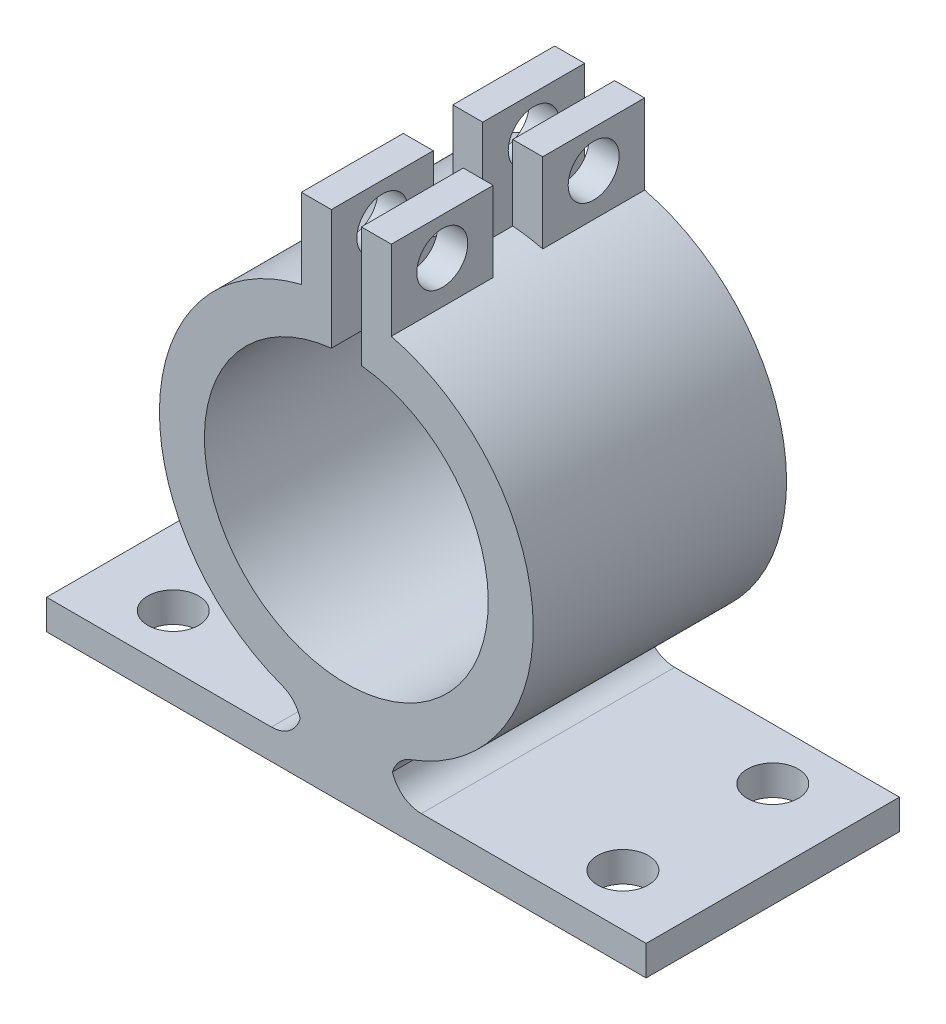
ISO-10303-21;
HEADER;
FILE_DESCRIPTION(('STEP AP214'),'2;1');
FILE_NAME('part.step','',(''),(''),'','','');
FILE_SCHEMA(('AUTOMOTIVE_DESIGN { 1 0 10303 214 1 1 1 1 }'));
ENDSEC;
DATA;
#1=APPLICATION_CONTEXT('core data for automotive mechanical design processes');
#2=APPLICATION_PROTOCOL_DEFINITION('international standard','automotive_design',2000,#1);
#3=PRODUCT_CONTEXT('',#1,'mechanical');
#4=PRODUCT('Part','Part','',(#3));
#5=PRODUCT_RELATED_PRODUCT_CATEGORY('part','',(#4));
#6=PRODUCT_DEFINITION_FORMATION('','',#4);
#7=PRODUCT_DEFINITION_CONTEXT('part definition',#1,'design');
#8=PRODUCT_DEFINITION('design','',#6,#7);
#9=PRODUCT_DEFINITION_SHAPE('','',#8);
#10=(LENGTH_UNIT() NAMED_UNIT(*) SI_UNIT(.MILLI.,.METRE.));
#11=(NAMED_UNIT(*) PLANE_ANGLE_UNIT() SI_UNIT($,.RADIAN.));
#12=(NAMED_UNIT(*) SI_UNIT($,.STERADIAN.) SOLID_ANGLE_UNIT());
#13=UNCERTAINTY_MEASURE_WITH_UNIT(LENGTH_MEASURE(1.E-05),#10,'distance_accuracy_value','');
#14=(GEOMETRIC_REPRESENTATION_CONTEXT(3) GLOBAL_UNCERTAINTY_ASSIGNED_CONTEXT((#13)) GLOBAL_UNIT_ASSIGNED_CONTEXT((#10,
#11,#12)) REPRESENTATION_CONTEXT('',''));
#15=CARTESIAN_POINT('',(0.,0.,0.));
#16=DIRECTION('',(0.,0.,1.));
#17=DIRECTION('',(1.,0.,0.));
#18=AXIS2_PLACEMENT_3D('',#15,#16,#17);
#19=CARTESIAN_POINT('',(0.,0.,16.9));
#20=DIRECTION('',(0.,0.,-1.));
#21=DIRECTION('',(-1.,0.,0.));
#22=AXIS2_PLACEMENT_3D('',#19,#20,#21);
#23=CYLINDRICAL_SURFACE('',#22,12.47);
#24=CARTESIAN_POINT('',(0.,0.,16.9));
#25=DIRECTION('',(0.,0.,1.));
#26=DIRECTION('',(1.,0.,0.));
#27=AXIS2_PLACEMENT_3D('',#24,#25,#26);
#28=CIRCLE('',#27,12.47);
#29=CARTESIAN_POINT('',(4.30891499654458,-11.7018866663694,16.9));
#30=VERTEX_POINT('',#29);
#31=CARTESIAN_POINT('',(3.,12.1037556155104,16.9));
#32=VERTEX_POINT('',#31);
#33=EDGE_CURVE('E390',#30,#32,#28,.T.);
#34=ORIENTED_EDGE('',*,*,#33,.F.);
#35=DIRECTION('',(0.,0.,-1.));
#36=VECTOR('',#35,1.);
#37=CARTESIAN_POINT('',(4.30891499654458,-11.7018866663694,16.9));
#38=LINE('',#37,#36);
#39=CARTESIAN_POINT('',(4.30891499654458,-11.7018866663694,0.));
#40=VERTEX_POINT('',#39);
#41=EDGE_CURVE('E417',#30,#40,#38,.T.);
#42=ORIENTED_EDGE('',*,*,#41,.T.);
#43=CARTESIAN_POINT('',(0.,0.,0.));
#44=DIRECTION('',(0.,0.,1.));
#45=DIRECTION('',(1.,0.,0.));
#46=AXIS2_PLACEMENT_3D('',#43,#44,#45);
#47=CIRCLE('',#46,12.47);
#48=CARTESIAN_POINT('',(3.,12.1037556155104,0.));
#49=VERTEX_POINT('',#48);
#50=EDGE_CURVE('E225',#40,#49,#47,.T.);
#51=ORIENTED_EDGE('',*,*,#50,.T.);
#52=DIRECTION('',(0.,0.,-1.));
#53=VECTOR('',#52,1.);
#54=CARTESIAN_POINT('',(3.,12.1037556155104,16.9));
#55=LINE('',#54,#53);
#56=CARTESIAN_POINT('',(3.,12.1037556155104,6.8));
#57=VERTEX_POINT('',#56);
#58=EDGE_CURVE('E321',#49,#57,#55,.F.);
#59=ORIENTED_EDGE('',*,*,#58,.T.);
#60=CARTESIAN_POINT('',(0.,0.,6.8));
#61=DIRECTION('',(0.,0.,-1.));
#62=DIRECTION('',(-1.,0.,0.));
#63=AXIS2_PLACEMENT_3D('',#60,#61,#62);
#64=CIRCLE('',#63,12.47);
#65=CARTESIAN_POINT('',(1.,12.4298390979127,6.8));
#66=VERTEX_POINT('',#65);
#67=EDGE_CURVE('E314',#57,#66,#64,.F.);
#68=ORIENTED_EDGE('',*,*,#67,.T.);
#69=DIRECTION('',(0.,0.,-1.));
#70=VECTOR('',#69,1.);
#71=CARTESIAN_POINT('',(1.,12.4298390979127,16.9));
#72=LINE('',#71,#70);
#73=CARTESIAN_POINT('',(1.,12.4298390979127,10.1));
#74=VERTEX_POINT('',#73);
#75=EDGE_CURVE('E408',#74,#66,#72,.T.);
#76=ORIENTED_EDGE('',*,*,#75,.F.);
#77=CARTESIAN_POINT('',(0.,0.,10.1));
#78=DIRECTION('',(0.,0.,1.));
#79=DIRECTION('',(1.,0.,0.));
#80=AXIS2_PLACEMENT_3D('',#77,#78,#79);
#81=CIRCLE('',#80,12.47);
#82=CARTESIAN_POINT('',(3.,12.1037556155104,10.1));
#83=VERTEX_POINT('',#82);
#84=EDGE_CURVE('E290',#74,#83,#81,.F.);
#85=ORIENTED_EDGE('',*,*,#84,.T.);
#86=DIRECTION('',(0.,0.,-1.));
#87=VECTOR('',#86,1.);
#88=CARTESIAN_POINT('',(3.,12.1037556155104,16.9));
#89=LINE('',#88,#87);
#90=EDGE_CURVE('E288',#83,#32,#89,.F.);
#91=ORIENTED_EDGE('',*,*,#90,.T.);
#92=EDGE_LOOP('',(#34,#42,#51,#59,#68,#76,#85,#91));
#93=FACE_BOUND('',#92,.T.);
#94=ADVANCED_FACE('F41',(#93),#23,.T.);
#95=CARTESIAN_POINT('',(-3.,12.1037556155104,0.));
#96=VERTEX_POINT('',#95);
#97=CARTESIAN_POINT('',(-4.30891499654457,-11.7018866663694,0.));
#98=VERTEX_POINT('',#97);
#99=EDGE_CURVE('E226',#96,#98,#47,.T.);
#100=ORIENTED_EDGE('',*,*,#99,.T.);
#101=DIRECTION('',(0.,0.,-1.));
#102=VECTOR('',#101,1.);
#103=CARTESIAN_POINT('',(-4.30891499654457,-11.7018866663694,16.9));
#104=LINE('',#103,#102);
#105=CARTESIAN_POINT('',(-4.30891499654457,-11.7018866663694,16.9));
#106=VERTEX_POINT('',#105);
#107=EDGE_CURVE('E412',#98,#106,#104,.F.);
#108=ORIENTED_EDGE('',*,*,#107,.T.);
#109=CARTESIAN_POINT('',(-3.,12.1037556155104,16.9));
#110=VERTEX_POINT('',#109);
#111=EDGE_CURVE('E386',#110,#106,#28,.T.);
#112=ORIENTED_EDGE('',*,*,#111,.F.);
#113=DIRECTION('',(0.,0.,-1.));
#114=VECTOR('',#113,1.);
#115=CARTESIAN_POINT('',(-3.,12.1037556155104,16.9));
#116=LINE('',#115,#114);
#117=CARTESIAN_POINT('',(-3.,12.1037556155104,10.1));
#118=VERTEX_POINT('',#117);
#119=EDGE_CURVE('E349',#110,#118,#116,.T.);
#120=ORIENTED_EDGE('',*,*,#119,.T.);
#121=CARTESIAN_POINT('',(0.,0.,10.1));
#122=DIRECTION('',(0.,0.,1.));
#123=DIRECTION('',(1.,0.,0.));
#124=AXIS2_PLACEMENT_3D('',#121,#122,#123);
#125=CIRCLE('',#124,12.47);
#126=CARTESIAN_POINT('',(-1.,12.4298390979127,10.1));
#127=VERTEX_POINT('',#126);
#128=EDGE_CURVE('E345',#118,#127,#125,.F.);
#129=ORIENTED_EDGE('',*,*,#128,.T.);
#130=DIRECTION('',(0.,0.,-1.));
#131=VECTOR('',#130,1.);
#132=CARTESIAN_POINT('',(-1.,12.4298390979127,16.9));
#133=LINE('',#132,#131);
#134=CARTESIAN_POINT('',(-1.,12.4298390979127,6.8));
#135=VERTEX_POINT('',#134);
#136=EDGE_CURVE('E410',#127,#135,#133,.T.);
#137=ORIENTED_EDGE('',*,*,#136,.T.);
#138=CARTESIAN_POINT('',(0.,0.,6.8));
#139=DIRECTION('',(0.,0.,-1.));
#140=DIRECTION('',(-1.,0.,0.));
#141=AXIS2_PLACEMENT_3D('',#138,#139,#140);
#142=CIRCLE('',#141,12.47);
#143=CARTESIAN_POINT('',(-3.,12.1037556155104,6.8));
#144=VERTEX_POINT('',#143);
#145=EDGE_CURVE('E372',#135,#144,#142,.F.);
#146=ORIENTED_EDGE('',*,*,#145,.T.);
#147=DIRECTION('',(0.,0.,-1.));
#148=VECTOR('',#147,1.);
#149=CARTESIAN_POINT('',(-3.,12.1037556155104,16.9));
#150=LINE('',#149,#148);
#151=EDGE_CURVE('E375',#144,#96,#150,.T.);
#152=ORIENTED_EDGE('',*,*,#151,.T.);
#153=EDGE_LOOP('',(#100,#108,#112,#120,#129,#137,#146,#152));
#154=FACE_BOUND('',#153,.T.);
#155=ADVANCED_FACE('F467',(#154),#23,.T.);
#156=CARTESIAN_POINT('',(-1.,0.,16.9));
#157=DIRECTION('',(-1.,0.,0.));
#158=DIRECTION('',(0.,0.,1.));
#159=AXIS2_PLACEMENT_3D('',#156,#157,#158);
#160=PLANE('',#159);
#161=DIRECTION('',(0.,1.,0.));
#162=VECTOR('',#161,1.);
#163=CARTESIAN_POINT('',(-1.,0.,0.));
#164=LINE('',#163,#162);
#165=CARTESIAN_POINT('',(-1.,9.41705367936278,0.));
#166=VERTEX_POINT('',#165);
#167=CARTESIAN_POINT('',(-1.,17.4298390979127,0.));
#168=VERTEX_POINT('',#167);
#169=EDGE_CURVE('E382',#166,#168,#164,.T.);
#170=ORIENTED_EDGE('',*,*,#169,.T.);
#171=DIRECTION('',(0.,0.,1.));
#172=VECTOR('',#171,1.);
#173=CARTESIAN_POINT('',(-1.,17.4298390979127,0.));
#174=LINE('',#173,#172);
#175=CARTESIAN_POINT('',(-1.,17.4298390979127,6.8));
#176=VERTEX_POINT('',#175);
#177=EDGE_CURVE('E363',#168,#176,#174,.T.);
#178=ORIENTED_EDGE('',*,*,#177,.T.);
#179=DIRECTION('',(0.,-1.,0.));
#180=VECTOR('',#179,1.);
#181=CARTESIAN_POINT('',(-1.,12.4298390979127,6.8));
#182=LINE('',#181,#180);
#183=EDGE_CURVE('E360',#176,#135,#182,.T.);
#184=ORIENTED_EDGE('',*,*,#183,.T.);
#185=ORIENTED_EDGE('',*,*,#136,.F.);
#186=DIRECTION('',(0.,1.,0.));
#187=VECTOR('',#186,1.);
#188=CARTESIAN_POINT('',(-1.,12.4298390979127,10.1));
#189=LINE('',#188,#187);
#190=CARTESIAN_POINT('',(-1.,17.4298390979127,10.1));
#191=VERTEX_POINT('',#190);
#192=EDGE_CURVE('E328',#127,#191,#189,.T.);
#193=ORIENTED_EDGE('',*,*,#192,.T.);
#194=DIRECTION('',(0.,0.,1.));
#195=VECTOR('',#194,1.);
#196=CARTESIAN_POINT('',(-1.,17.4298390979127,16.9));
#197=LINE('',#196,#195);
#198=CARTESIAN_POINT('',(-1.,17.4298390979127,16.9));
#199=VERTEX_POINT('',#198);
#200=EDGE_CURVE('E335',#191,#199,#197,.T.);
#201=ORIENTED_EDGE('',*,*,#200,.T.);
#202=DIRECTION('',(0.,1.,0.));
#203=VECTOR('',#202,1.);
#204=CARTESIAN_POINT('',(-1.,0.,16.9));
#205=LINE('',#204,#203);
#206=CARTESIAN_POINT('',(-1.,9.41705367936278,16.9));
#207=VERTEX_POINT('',#206);
#208=EDGE_CURVE('E384',#207,#199,#205,.T.);
#209=ORIENTED_EDGE('',*,*,#208,.F.);
#210=DIRECTION('',(0.,0.,-1.));
#211=VECTOR('',#210,1.);
#212=CARTESIAN_POINT('',(-1.,9.41705367936278,16.9));
#213=LINE('',#212,#211);
#214=EDGE_CURVE('E397',#207,#166,#213,.T.);
#215=ORIENTED_EDGE('',*,*,#214,.T.);
#216=EDGE_LOOP('',(#170,#178,#184,#185,#193,#201,#209,#215));
#217=FACE_BOUND('',#216,.T.);
#218=CARTESIAN_POINT('',(-1.,14.9298390979127,3.4));
#219=DIRECTION('',(1.,0.,0.));
#220=DIRECTION('',(0.,0.,1.));
#221=AXIS2_PLACEMENT_3D('',#218,#219,#220);
#222=CIRCLE('',#221,1.7);
#223=CARTESIAN_POINT('',(-1.,14.9298390979127,5.1));
#224=VERTEX_POINT('',#223);
#225=EDGE_CURVE('E369',#224,#224,#222,.T.);
#226=ORIENTED_EDGE('',*,*,#225,.F.);
#227=EDGE_LOOP('',(#226));
#228=FACE_BOUND('',#227,.T.);
#229=CARTESIAN_POINT('',(-1.,14.9298390979127,13.5));
#230=DIRECTION('',(1.,0.,0.));
#231=DIRECTION('',(0.,0.,-1.));
#232=AXIS2_PLACEMENT_3D('',#229,#230,#231);
#233=CIRCLE('',#232,1.7);
#234=CARTESIAN_POINT('',(-1.,14.9298390979127,11.8));
#235=VERTEX_POINT('',#234);
#236=EDGE_CURVE('E318',#235,#235,#233,.T.);
#237=ORIENTED_EDGE('',*,*,#236,.F.);
#238=EDGE_LOOP('',(#237));
#239=FACE_BOUND('',#238,.T.);
#240=ADVANCED_FACE('F485',(#217,#228,#239),#160,.F.);
#241=CARTESIAN_POINT('',(0.,-16.47,16.9));
#242=DIRECTION('',(0.,1.,0.));
#243=DIRECTION('',(0.,0.,1.));
#244=AXIS2_PLACEMENT_3D('',#241,#242,#243);
#245=PLANE('',#244);
#246=CARTESIAN_POINT('',(-15.,-16.47,13.45));
#247=DIRECTION('',(0.,-1.,0.));
#248=DIRECTION('',(0.,0.,-1.));
#249=AXIS2_PLACEMENT_3D('',#246,#247,#248);
#250=CIRCLE('',#249,1.7);
#251=CARTESIAN_POINT('',(-15.,-16.47,11.75));
#252=VERTEX_POINT('',#251);
#253=EDGE_CURVE('E845',#252,#252,#250,.T.);
#254=ORIENTED_EDGE('',*,*,#253,.F.);
#255=EDGE_LOOP('',(#254));
#256=FACE_BOUND('',#255,.T.);
#257=CARTESIAN_POINT('',(15.,-16.47,3.45));
#258=DIRECTION('',(0.,-1.,0.));
#259=DIRECTION('',(0.,0.,-1.));
#260=AXIS2_PLACEMENT_3D('',#257,#258,#259);
#261=CIRCLE('',#260,1.69999999999999);
#262=CARTESIAN_POINT('',(15.,-16.47,1.75000000000001));
#263=VERTEX_POINT('',#262);
#264=EDGE_CURVE('E842',#263,#263,#261,.T.);
#265=ORIENTED_EDGE('',*,*,#264,.F.);
#266=EDGE_LOOP('',(#265));
#267=FACE_BOUND('',#266,.T.);
#268=CARTESIAN_POINT('',(15.,-16.47,13.45));
#269=DIRECTION('',(0.,-1.,0.));
#270=DIRECTION('',(0.,0.,-1.));
#271=AXIS2_PLACEMENT_3D('',#268,#269,#270);
#272=CIRCLE('',#271,1.7);
#273=CARTESIAN_POINT('',(15.,-16.47,11.75));
#274=VERTEX_POINT('',#273);
#275=EDGE_CURVE('E435',#274,#274,#272,.T.);
#276=ORIENTED_EDGE('',*,*,#275,.F.);
#277=EDGE_LOOP('',(#276));
#278=FACE_BOUND('',#277,.T.);
#279=CARTESIAN_POINT('',(-15.,-16.47,3.45));
#280=DIRECTION('',(0.,-1.,0.));
#281=DIRECTION('',(0.,0.,-1.));
#282=AXIS2_PLACEMENT_3D('',#279,#280,#281);
#283=CIRCLE('',#282,1.7);
#284=CARTESIAN_POINT('',(-15.,-16.47,1.75));
#285=VERTEX_POINT('',#284);
#286=EDGE_CURVE('E241',#285,#285,#283,.T.);
#287=ORIENTED_EDGE('',*,*,#286,.F.);
#288=EDGE_LOOP('',(#287));
#289=FACE_BOUND('',#288,.T.);
#290=DIRECTION('',(1.,0.,0.));
#291=VECTOR('',#290,1.);
#292=CARTESIAN_POINT('',(0.,-16.47,0.));
#293=LINE('',#292,#291);
#294=CARTESIAN_POINT('',(-20.,-16.47,0.));
#295=VERTEX_POINT('',#294);
#296=CARTESIAN_POINT('',(20.,-16.47,0.));
#297=VERTEX_POINT('',#296);
#298=EDGE_CURVE('E214',#295,#297,#293,.T.);
#299=ORIENTED_EDGE('',*,*,#298,.T.);
#300=DIRECTION('',(0.,0.,1.));
#301=VECTOR('',#300,1.);
#302=CARTESIAN_POINT('',(20.,-16.47,0.));
#303=LINE('',#302,#301);
#304=CARTESIAN_POINT('',(20.,-16.47,16.9));
#305=VERTEX_POINT('',#304);
#306=EDGE_CURVE('E251',#297,#305,#303,.T.);
#307=ORIENTED_EDGE('',*,*,#306,.T.);
#308=DIRECTION('',(1.,0.,0.));
#309=VECTOR('',#308,1.);
#310=CARTESIAN_POINT('',(0.,-16.47,16.9));
#311=LINE('',#310,#309);
#312=CARTESIAN_POINT('',(-20.,-16.47,16.9));
#313=VERTEX_POINT('',#312);
#314=EDGE_CURVE('E231',#313,#305,#311,.T.);
#315=ORIENTED_EDGE('',*,*,#314,.F.);
#316=DIRECTION('',(0.,0.,1.));
#317=VECTOR('',#316,1.);
#318=CARTESIAN_POINT('',(-20.,-16.47,0.));
#319=LINE('',#318,#317);
#320=EDGE_CURVE('E229',#295,#313,#319,.T.);
#321=ORIENTED_EDGE('',*,*,#320,.F.);
#322=EDGE_LOOP('',(#299,#307,#315,#321));
#323=FACE_BOUND('',#322,.T.);
#324=ADVANCED_FACE('F230',(#256,#267,#278,#289,#323),#245,.F.);
#325=CARTESIAN_POINT('',(1.,0.,16.9));
#326=DIRECTION('',(-1.,0.,0.));
#327=DIRECTION('',(0.,0.,1.));
#328=AXIS2_PLACEMENT_3D('',#325,#326,#327);
#329=PLANE('',#328);
#330=DIRECTION('',(0.,1.,0.));
#331=VECTOR('',#330,1.);
#332=CARTESIAN_POINT('',(1.,0.,0.));
#333=LINE('',#332,#331);
#334=CARTESIAN_POINT('',(1.,9.41705367936278,0.));
#335=VERTEX_POINT('',#334);
#336=CARTESIAN_POINT('',(1.,17.4298390979127,0.));
#337=VERTEX_POINT('',#336);
#338=EDGE_CURVE('E401',#335,#337,#333,.T.);
#339=ORIENTED_EDGE('',*,*,#338,.F.);
#340=DIRECTION('',(0.,0.,-1.));
#341=VECTOR('',#340,1.);
#342=CARTESIAN_POINT('',(1.,9.41705367936278,16.9));
#343=LINE('',#342,#341);
#344=CARTESIAN_POINT('',(1.,9.41705367936278,16.9));
#345=VERTEX_POINT('',#344);
#346=EDGE_CURVE('E406',#345,#335,#343,.T.);
#347=ORIENTED_EDGE('',*,*,#346,.F.);
#348=DIRECTION('',(0.,1.,0.));
#349=VECTOR('',#348,1.);
#350=CARTESIAN_POINT('',(1.,0.,16.9));
#351=LINE('',#350,#349);
#352=CARTESIAN_POINT('',(1.,17.4298390979127,16.9));
#353=VERTEX_POINT('',#352);
#354=EDGE_CURVE('E392',#345,#353,#351,.T.);
#355=ORIENTED_EDGE('',*,*,#354,.T.);
#356=DIRECTION('',(0.,0.,-1.));
#357=VECTOR('',#356,1.);
#358=CARTESIAN_POINT('',(1.,17.4298390979127,16.9));
#359=LINE('',#358,#357);
#360=CARTESIAN_POINT('',(1.,17.4298390979127,10.1));
#361=VERTEX_POINT('',#360);
#362=EDGE_CURVE('E274',#353,#361,#359,.T.);
#363=ORIENTED_EDGE('',*,*,#362,.T.);
#364=DIRECTION('',(0.,-1.,0.));
#365=VECTOR('',#364,1.);
#366=CARTESIAN_POINT('',(1.,12.4298390979127,10.1));
#367=LINE('',#366,#365);
#368=EDGE_CURVE('E272',#361,#74,#367,.T.);
#369=ORIENTED_EDGE('',*,*,#368,.T.);
#370=ORIENTED_EDGE('',*,*,#75,.T.);
#371=DIRECTION('',(0.,1.,0.));
#372=VECTOR('',#371,1.);
#373=CARTESIAN_POINT('',(1.,12.4298390979127,6.8));
#374=LINE('',#373,#372);
#375=CARTESIAN_POINT('',(1.,17.4298390979127,6.8));
#376=VERTEX_POINT('',#375);
#377=EDGE_CURVE('E299',#66,#376,#374,.T.);
#378=ORIENTED_EDGE('',*,*,#377,.T.);
#379=DIRECTION('',(0.,0.,-1.));
#380=VECTOR('',#379,1.);
#381=CARTESIAN_POINT('',(1.,17.4298390979127,0.));
#382=LINE('',#381,#380);
#383=EDGE_CURVE('E306',#376,#337,#382,.T.);
#384=ORIENTED_EDGE('',*,*,#383,.T.);
#385=EDGE_LOOP('',(#339,#347,#355,#363,#369,#370,#378,#384));
#386=FACE_BOUND('',#385,.T.);
#387=CARTESIAN_POINT('',(1.,14.9298390979127,3.4));
#388=DIRECTION('',(-1.,0.,0.));
#389=DIRECTION('',(0.,0.,1.));
#390=AXIS2_PLACEMENT_3D('',#387,#388,#389);
#391=CIRCLE('',#390,1.7);
#392=CARTESIAN_POINT('',(1.,14.9298390979127,5.1));
#393=VERTEX_POINT('',#392);
#394=EDGE_CURVE('E293',#393,#393,#391,.T.);
#395=ORIENTED_EDGE('',*,*,#394,.F.);
#396=EDGE_LOOP('',(#395));
#397=FACE_BOUND('',#396,.T.);
#398=CARTESIAN_POINT('',(1.,14.9298390979127,13.5));
#399=DIRECTION('',(-1.,0.,0.));
#400=DIRECTION('',(0.,0.,-1.));
#401=AXIS2_PLACEMENT_3D('',#398,#399,#400);
#402=CIRCLE('',#401,1.7);
#403=CARTESIAN_POINT('',(1.,14.9298390979127,11.8));
#404=VERTEX_POINT('',#403);
#405=EDGE_CURVE('E280',#404,#404,#402,.T.);
#406=ORIENTED_EDGE('',*,*,#405,.F.);
#407=EDGE_LOOP('',(#406));
#408=FACE_BOUND('',#407,.T.);
#409=ADVANCED_FACE('F512',(#386,#397,#408),#329,.T.);
#410=CARTESIAN_POINT('',(0.,0.,16.9));
#411=DIRECTION('',(0.,0.,-1.));
#412=DIRECTION('',(-1.,0.,0.));
#413=AXIS2_PLACEMENT_3D('',#410,#411,#412);
#414=CYLINDRICAL_SURFACE('',#413,9.47);
#415=CARTESIAN_POINT('',(0.,0.,0.));
#416=DIRECTION('',(0.,0.,1.));
#417=DIRECTION('',(1.,0.,0.));
#418=AXIS2_PLACEMENT_3D('',#415,#416,#417);
#419=CIRCLE('',#418,9.47);
#420=EDGE_CURVE('E387',#166,#335,#419,.T.);
#421=ORIENTED_EDGE('',*,*,#420,.F.);
#422=ORIENTED_EDGE('',*,*,#214,.F.);
#423=CARTESIAN_POINT('',(0.,0.,16.9));
#424=DIRECTION('',(0.,0.,1.));
#425=DIRECTION('',(1.,0.,0.));
#426=AXIS2_PLACEMENT_3D('',#423,#424,#425);
#427=CIRCLE('',#426,9.47);
#428=EDGE_CURVE('E394',#207,#345,#427,.T.);
#429=ORIENTED_EDGE('',*,*,#428,.T.);
#430=ORIENTED_EDGE('',*,*,#346,.T.);
#431=EDGE_LOOP('',(#421,#422,#429,#430));
#432=FACE_BOUND('',#431,.T.);
#433=ADVANCED_FACE('F567',(#432),#414,.F.);
#434=CARTESIAN_POINT('',(0.,0.,16.9));
#435=DIRECTION('',(0.,0.,1.));
#436=DIRECTION('',(1.,0.,0.));
#437=AXIS2_PLACEMENT_3D('',#434,#435,#436);
#438=PLANE('',#437);
#439=CARTESIAN_POINT('',(-5.,-13.5786928678721,16.9));
#440=DIRECTION('',(0.,0.,1.));
#441=DIRECTION('',(1.,0.,0.));
#442=AXIS2_PLACEMENT_3D('',#439,#440,#441);
#443=CIRCLE('',#442,2.);
#444=CARTESIAN_POINT('',(-3.07836006723882,-13.024346433936,16.9));
#445=VERTEX_POINT('',#444);
#446=EDGE_CURVE('E424',#106,#445,#443,.F.);
#447=ORIENTED_EDGE('',*,*,#446,.T.);
#448=CARTESIAN_POINT('',(-5.,-12.47,16.9));
#449=DIRECTION('',(0.,0.,1.));
#450=DIRECTION('',(1.,0.,0.));
#451=AXIS2_PLACEMENT_3D('',#448,#449,#450);
#452=CIRCLE('',#451,2.);
#453=CARTESIAN_POINT('',(-5.,-14.47,16.9));
#454=VERTEX_POINT('',#453);
#455=EDGE_CURVE('E426',#445,#454,#452,.F.);
#456=ORIENTED_EDGE('',*,*,#455,.T.);
#457=DIRECTION('',(-1.,0.,0.));
#458=VECTOR('',#457,1.);
#459=CARTESIAN_POINT('',(20.,-14.47,16.9));
#460=LINE('',#459,#458);
#461=CARTESIAN_POINT('',(-20.,-14.47,16.9));
#462=VERTEX_POINT('',#461);
#463=EDGE_CURVE('E259',#454,#462,#460,.T.);
#464=ORIENTED_EDGE('',*,*,#463,.T.);
#465=DIRECTION('',(0.,1.,0.));
#466=VECTOR('',#465,1.);
#467=CARTESIAN_POINT('',(-20.,-16.47,16.9));
#468=LINE('',#467,#466);
#469=EDGE_CURVE('E235',#313,#462,#468,.T.);
#470=ORIENTED_EDGE('',*,*,#469,.F.);
#471=ORIENTED_EDGE('',*,*,#314,.T.);
#472=DIRECTION('',(0.,1.,0.));
#473=VECTOR('',#472,1.);
#474=CARTESIAN_POINT('',(20.,-16.47,16.9));
#475=LINE('',#474,#473);
#476=CARTESIAN_POINT('',(20.,-14.47,16.9));
#477=VERTEX_POINT('',#476);
#478=EDGE_CURVE('E253',#305,#477,#475,.T.);
#479=ORIENTED_EDGE('',*,*,#478,.T.);
#480=CARTESIAN_POINT('',(5.,-14.47,16.9));
#481=VERTEX_POINT('',#480);
#482=EDGE_CURVE('E265',#477,#481,#460,.T.);
#483=ORIENTED_EDGE('',*,*,#482,.T.);
#484=CARTESIAN_POINT('',(5.,-12.47,16.9));
#485=DIRECTION('',(0.,0.,1.));
#486=DIRECTION('',(1.,0.,0.));
#487=AXIS2_PLACEMENT_3D('',#484,#485,#486);
#488=CIRCLE('',#487,2.);
#489=CARTESIAN_POINT('',(3.07836006723882,-13.024346433936,16.9));
#490=VERTEX_POINT('',#489);
#491=EDGE_CURVE('E50',#481,#490,#488,.F.);
#492=ORIENTED_EDGE('',*,*,#491,.T.);
#493=CARTESIAN_POINT('',(5.,-13.5786928678721,16.9));
#494=DIRECTION('',(0.,0.,1.));
#495=DIRECTION('',(1.,0.,0.));
#496=AXIS2_PLACEMENT_3D('',#493,#494,#495);
#497=CIRCLE('',#496,2.);
#498=EDGE_CURVE('E431',#490,#30,#497,.F.);
#499=ORIENTED_EDGE('',*,*,#498,.T.);
#500=ORIENTED_EDGE('',*,*,#33,.T.);
#501=DIRECTION('',(0.,1.,0.));
#502=VECTOR('',#501,1.);
#503=CARTESIAN_POINT('',(3.,-16.472,16.9));
#504=LINE('',#503,#502);
#505=CARTESIAN_POINT('',(3.,17.4298390979127,16.9));
#506=VERTEX_POINT('',#505);
#507=EDGE_CURVE('E286',#32,#506,#504,.T.);
#508=ORIENTED_EDGE('',*,*,#507,.T.);
#509=DIRECTION('',(-1.,0.,0.));
#510=VECTOR('',#509,1.);
#511=CARTESIAN_POINT('',(3.,17.4298390979127,16.9));
#512=LINE('',#511,#510);
#513=EDGE_CURVE('E267',#506,#353,#512,.T.);
#514=ORIENTED_EDGE('',*,*,#513,.T.);
#515=ORIENTED_EDGE('',*,*,#354,.F.);
#516=ORIENTED_EDGE('',*,*,#428,.F.);
#517=ORIENTED_EDGE('',*,*,#208,.T.);
#518=DIRECTION('',(1.,0.,0.));
#519=VECTOR('',#518,1.);
#520=CARTESIAN_POINT('',(-3.,17.4298390979127,16.9));
#521=LINE('',#520,#519);
#522=CARTESIAN_POINT('',(-3.,17.4298390979127,16.9));
#523=VERTEX_POINT('',#522);
#524=EDGE_CURVE('E340',#523,#199,#521,.T.);
#525=ORIENTED_EDGE('',*,*,#524,.F.);
#526=DIRECTION('',(0.,1.,0.));
#527=VECTOR('',#526,1.);
#528=CARTESIAN_POINT('',(-3.,-16.472,16.9));
#529=LINE('',#528,#527);
#530=EDGE_CURVE('E343',#110,#523,#529,.T.);
#531=ORIENTED_EDGE('',*,*,#530,.F.);
#532=ORIENTED_EDGE('',*,*,#111,.T.);
#533=EDGE_LOOP('',(#447,#456,#464,#470,#471,#479,#483,#492,#499,#500,#508,#514,#515,#516,#517,
#525,#531,#532));
#534=FACE_BOUND('',#533,.T.);
#535=ADVANCED_FACE('F455',(#534),#438,.T.);
#536=CARTESIAN_POINT('',(0.,0.,0.));
#537=DIRECTION('',(0.,0.,1.));
#538=DIRECTION('',(1.,0.,0.));
#539=AXIS2_PLACEMENT_3D('',#536,#537,#538);
#540=PLANE('',#539);
#541=CARTESIAN_POINT('',(5.,-13.5786928678721,0.));
#542=DIRECTION('',(0.,0.,1.));
#543=DIRECTION('',(1.,0.,0.));
#544=AXIS2_PLACEMENT_3D('',#541,#542,#543);
#545=CIRCLE('',#544,2.);
#546=CARTESIAN_POINT('',(3.07836006723882,-13.024346433936,0.));
#547=VERTEX_POINT('',#546);
#548=EDGE_CURVE('E64',#40,#547,#545,.T.);
#549=ORIENTED_EDGE('',*,*,#548,.T.);
#550=CARTESIAN_POINT('',(5.,-12.47,0.));
#551=DIRECTION('',(0.,0.,1.));
#552=DIRECTION('',(1.,0.,0.));
#553=AXIS2_PLACEMENT_3D('',#550,#551,#552);
#554=CIRCLE('',#553,2.);
#555=CARTESIAN_POINT('',(5.,-14.47,0.));
#556=VERTEX_POINT('',#555);
#557=EDGE_CURVE('E11',#547,#556,#554,.T.);
#558=ORIENTED_EDGE('',*,*,#557,.T.);
#559=DIRECTION('',(-1.,0.,0.));
#560=VECTOR('',#559,1.);
#561=CARTESIAN_POINT('',(20.,-14.47,0.));
#562=LINE('',#561,#560);
#563=CARTESIAN_POINT('',(20.,-14.47,0.));
#564=VERTEX_POINT('',#563);
#565=EDGE_CURVE('E260',#564,#556,#562,.T.);
#566=ORIENTED_EDGE('',*,*,#565,.F.);
#567=DIRECTION('',(0.,-1.,0.));
#568=VECTOR('',#567,1.);
#569=CARTESIAN_POINT('',(20.,-16.47,0.));
#570=LINE('',#569,#568);
#571=EDGE_CURVE('E221',#564,#297,#570,.T.);
#572=ORIENTED_EDGE('',*,*,#571,.T.);
#573=ORIENTED_EDGE('',*,*,#298,.F.);
#574=DIRECTION('',(0.,-1.,0.));
#575=VECTOR('',#574,1.);
#576=CARTESIAN_POINT('',(-20.,-16.47,0.));
#577=LINE('',#576,#575);
#578=CARTESIAN_POINT('',(-20.,-14.47,0.));
#579=VERTEX_POINT('',#578);
#580=EDGE_CURVE('E219',#579,#295,#577,.T.);
#581=ORIENTED_EDGE('',*,*,#580,.F.);
#582=CARTESIAN_POINT('',(-5.,-14.47,0.));
#583=VERTEX_POINT('',#582);
#584=EDGE_CURVE('E264',#583,#579,#562,.T.);
#585=ORIENTED_EDGE('',*,*,#584,.F.);
#586=CARTESIAN_POINT('',(-5.,-12.47,0.));
#587=DIRECTION('',(0.,0.,1.));
#588=DIRECTION('',(1.,0.,0.));
#589=AXIS2_PLACEMENT_3D('',#586,#587,#588);
#590=CIRCLE('',#589,2.);
#591=CARTESIAN_POINT('',(-3.07836006723882,-13.024346433936,0.));
#592=VERTEX_POINT('',#591);
#593=EDGE_CURVE('E428',#583,#592,#590,.T.);
#594=ORIENTED_EDGE('',*,*,#593,.T.);
#595=CARTESIAN_POINT('',(-5.,-13.5786928678721,0.));
#596=DIRECTION('',(0.,0.,1.));
#597=DIRECTION('',(1.,0.,0.));
#598=AXIS2_PLACEMENT_3D('',#595,#596,#597);
#599=CIRCLE('',#598,2.);
#600=EDGE_CURVE('E422',#592,#98,#599,.T.);
#601=ORIENTED_EDGE('',*,*,#600,.T.);
#602=ORIENTED_EDGE('',*,*,#99,.F.);
#603=DIRECTION('',(0.,1.,0.));
#604=VECTOR('',#603,1.);
#605=CARTESIAN_POINT('',(-3.,-16.472,0.));
#606=LINE('',#605,#604);
#607=CARTESIAN_POINT('',(-3.,17.4298390979127,0.));
#608=VERTEX_POINT('',#607);
#609=EDGE_CURVE('E378',#96,#608,#606,.T.);
#610=ORIENTED_EDGE('',*,*,#609,.T.);
#611=DIRECTION('',(1.,0.,0.));
#612=VECTOR('',#611,1.);
#613=CARTESIAN_POINT('',(-3.,17.4298390979127,0.));
#614=LINE('',#613,#612);
#615=EDGE_CURVE('E355',#608,#168,#614,.T.);
#616=ORIENTED_EDGE('',*,*,#615,.T.);
#617=ORIENTED_EDGE('',*,*,#169,.F.);
#618=ORIENTED_EDGE('',*,*,#420,.T.);
#619=ORIENTED_EDGE('',*,*,#338,.T.);
#620=DIRECTION('',(-1.,0.,0.));
#621=VECTOR('',#620,1.);
#622=CARTESIAN_POINT('',(3.,17.4298390979127,0.));
#623=LINE('',#622,#621);
#624=CARTESIAN_POINT('',(3.,17.4298390979127,0.));
#625=VERTEX_POINT('',#624);
#626=EDGE_CURVE('E311',#625,#337,#623,.T.);
#627=ORIENTED_EDGE('',*,*,#626,.F.);
#628=DIRECTION('',(0.,1.,0.));
#629=VECTOR('',#628,1.);
#630=CARTESIAN_POINT('',(3.,-16.472,0.));
#631=LINE('',#630,#629);
#632=EDGE_CURVE('E316',#49,#625,#631,.T.);
#633=ORIENTED_EDGE('',*,*,#632,.F.);
#634=ORIENTED_EDGE('',*,*,#50,.F.);
#635=EDGE_LOOP('',(#549,#558,#566,#572,#573,#581,#585,#594,#601,#602,#610,#616,#617,#618,#619,
#627,#633,#634));
#636=FACE_BOUND('',#635,.T.);
#637=ADVANCED_FACE('F216',(#636),#540,.F.);
#638=CARTESIAN_POINT('',(-3.,-16.472,6.8));
#639=DIRECTION('',(0.,0.,-1.));
#640=DIRECTION('',(-1.,0.,0.));
#641=AXIS2_PLACEMENT_3D('',#638,#639,#640);
#642=PLANE('',#641);
#643=ORIENTED_EDGE('',*,*,#145,.F.);
#644=ORIENTED_EDGE('',*,*,#183,.F.);
#645=DIRECTION('',(1.,0.,0.));
#646=VECTOR('',#645,1.);
#647=CARTESIAN_POINT('',(-3.,17.4298390979127,6.8));
#648=LINE('',#647,#646);
#649=CARTESIAN_POINT('',(-3.,17.4298390979127,6.8));
#650=VERTEX_POINT('',#649);
#651=EDGE_CURVE('E348',#650,#176,#648,.T.);
#652=ORIENTED_EDGE('',*,*,#651,.F.);
#653=DIRECTION('',(0.,1.,0.));
#654=VECTOR('',#653,1.);
#655=CARTESIAN_POINT('',(-3.,-16.472,6.8));
#656=LINE('',#655,#654);
#657=EDGE_CURVE('E380',#144,#650,#656,.T.);
#658=ORIENTED_EDGE('',*,*,#657,.F.);
#659=EDGE_LOOP('',(#643,#644,#652,#658));
#660=FACE_BOUND('',#659,.T.);
#661=ADVANCED_FACE('F488',(#660),#642,.F.);
#662=CARTESIAN_POINT('',(-3.,-16.472,6.8));
#663=DIRECTION('',(1.,0.,0.));
#664=DIRECTION('',(0.,0.,-1.));
#665=AXIS2_PLACEMENT_3D('',#662,#663,#664);
#666=PLANE('',#665);
#667=ORIENTED_EDGE('',*,*,#151,.F.);
#668=ORIENTED_EDGE('',*,*,#657,.T.);
#669=DIRECTION('',(0.,0.,1.));
#670=VECTOR('',#669,1.);
#671=CARTESIAN_POINT('',(-3.,17.4298390979127,0.));
#672=LINE('',#671,#670);
#673=EDGE_CURVE('E358',#608,#650,#672,.T.);
#674=ORIENTED_EDGE('',*,*,#673,.F.);
#675=ORIENTED_EDGE('',*,*,#609,.F.);
#676=EDGE_LOOP('',(#667,#668,#674,#675));
#677=FACE_BOUND('',#676,.T.);
#678=CARTESIAN_POINT('',(-3.,14.9298390979127,3.4));
#679=DIRECTION('',(1.,0.,0.));
#680=DIRECTION('',(0.,0.,1.));
#681=AXIS2_PLACEMENT_3D('',#678,#679,#680);
#682=CIRCLE('',#681,1.7);
#683=CARTESIAN_POINT('',(-3.,14.9298390979127,5.1));
#684=VERTEX_POINT('',#683);
#685=EDGE_CURVE('E366',#684,#684,#682,.T.);
#686=ORIENTED_EDGE('',*,*,#685,.T.);
#687=EDGE_LOOP('',(#686));
#688=FACE_BOUND('',#687,.T.);
#689=ADVANCED_FACE('F475',(#677,#688),#666,.F.);
#690=CARTESIAN_POINT('',(-3.,17.4298390979127,0.));
#691=DIRECTION('',(0.,1.,0.));
#692=DIRECTION('',(0.,0.,1.));
#693=AXIS2_PLACEMENT_3D('',#690,#691,#692);
#694=PLANE('',#693);
#695=ORIENTED_EDGE('',*,*,#177,.F.);
#696=ORIENTED_EDGE('',*,*,#615,.F.);
#697=ORIENTED_EDGE('',*,*,#673,.T.);
#698=ORIENTED_EDGE('',*,*,#651,.T.);
#699=EDGE_LOOP('',(#695,#696,#697,#698));
#700=FACE_BOUND('',#699,.T.);
#701=ADVANCED_FACE('F481',(#700),#694,.T.);
#702=CARTESIAN_POINT('',(-3.,14.9298390979127,3.4));
#703=DIRECTION('',(1.,0.,0.));
#704=DIRECTION('',(0.,0.,-1.));
#705=AXIS2_PLACEMENT_3D('',#702,#703,#704);
#706=CYLINDRICAL_SURFACE('',#705,1.7);
#707=ORIENTED_EDGE('',*,*,#685,.F.);
#708=EDGE_LOOP('',(#707));
#709=FACE_BOUND('',#708,.T.);
#710=ORIENTED_EDGE('',*,*,#225,.T.);
#711=EDGE_LOOP('',(#710));
#712=FACE_BOUND('',#711,.T.);
#713=ADVANCED_FACE('F500',(#709,#712),#706,.F.);
#714=CARTESIAN_POINT('',(-3.,-16.472,10.1));
#715=DIRECTION('',(0.,0.,1.));
#716=DIRECTION('',(1.,0.,0.));
#717=AXIS2_PLACEMENT_3D('',#714,#715,#716);
#718=PLANE('',#717);
#719=ORIENTED_EDGE('',*,*,#128,.F.);
#720=DIRECTION('',(0.,1.,0.));
#721=VECTOR('',#720,1.);
#722=CARTESIAN_POINT('',(-3.,-16.472,10.1));
#723=LINE('',#722,#721);
#724=CARTESIAN_POINT('',(-3.,17.4298390979127,10.1));
#725=VERTEX_POINT('',#724);
#726=EDGE_CURVE('E352',#118,#725,#723,.T.);
#727=ORIENTED_EDGE('',*,*,#726,.T.);
#728=DIRECTION('',(1.,0.,0.));
#729=VECTOR('',#728,1.);
#730=CARTESIAN_POINT('',(-3.,17.4298390979127,10.1));
#731=LINE('',#730,#729);
#732=EDGE_CURVE('E334',#725,#191,#731,.T.);
#733=ORIENTED_EDGE('',*,*,#732,.T.);
#734=ORIENTED_EDGE('',*,*,#192,.F.);
#735=EDGE_LOOP('',(#719,#727,#733,#734));
#736=FACE_BOUND('',#735,.T.);
#737=ADVANCED_FACE('F595',(#736),#718,.F.);
#738=CARTESIAN_POINT('',(-3.,-16.472,10.1));
#739=DIRECTION('',(1.,0.,0.));
#740=DIRECTION('',(0.,0.,-1.));
#741=AXIS2_PLACEMENT_3D('',#738,#739,#740);
#742=PLANE('',#741);
#743=ORIENTED_EDGE('',*,*,#119,.F.);
#744=ORIENTED_EDGE('',*,*,#530,.T.);
#745=DIRECTION('',(0.,0.,1.));
#746=VECTOR('',#745,1.);
#747=CARTESIAN_POINT('',(-3.,17.4298390979127,16.9));
#748=LINE('',#747,#746);
#749=EDGE_CURVE('E331',#725,#523,#748,.T.);
#750=ORIENTED_EDGE('',*,*,#749,.F.);
#751=ORIENTED_EDGE('',*,*,#726,.F.);
#752=EDGE_LOOP('',(#743,#744,#750,#751));
#753=FACE_BOUND('',#752,.T.);
#754=CARTESIAN_POINT('',(-3.,14.9298390979127,13.5));
#755=DIRECTION('',(1.,0.,0.));
#756=DIRECTION('',(0.,0.,-1.));
#757=AXIS2_PLACEMENT_3D('',#754,#755,#756);
#758=CIRCLE('',#757,1.7);
#759=CARTESIAN_POINT('',(-3.,14.9298390979127,11.8));
#760=VERTEX_POINT('',#759);
#761=EDGE_CURVE('E325',#760,#760,#758,.T.);
#762=ORIENTED_EDGE('',*,*,#761,.T.);
#763=EDGE_LOOP('',(#762));
#764=FACE_BOUND('',#763,.T.);
#765=ADVANCED_FACE('F592',(#753,#764),#742,.F.);
#766=CARTESIAN_POINT('',(-3.,17.4298390979127,16.9));
#767=DIRECTION('',(0.,1.,0.));
#768=DIRECTION('',(0.,0.,1.));
#769=AXIS2_PLACEMENT_3D('',#766,#767,#768);
#770=PLANE('',#769);
#771=ORIENTED_EDGE('',*,*,#200,.F.);
#772=ORIENTED_EDGE('',*,*,#732,.F.);
#773=ORIENTED_EDGE('',*,*,#749,.T.);
#774=ORIENTED_EDGE('',*,*,#524,.T.);
#775=EDGE_LOOP('',(#771,#772,#773,#774));
#776=FACE_BOUND('',#775,.T.);
#777=ADVANCED_FACE('F586',(#776),#770,.T.);
#778=CARTESIAN_POINT('',(-3.,14.9298390979127,13.5));
#779=DIRECTION('',(1.,0.,0.));
#780=DIRECTION('',(0.,0.,-1.));
#781=AXIS2_PLACEMENT_3D('',#778,#779,#780);
#782=CYLINDRICAL_SURFACE('',#781,1.7);
#783=ORIENTED_EDGE('',*,*,#761,.F.);
#784=EDGE_LOOP('',(#783));
#785=FACE_BOUND('',#784,.T.);
#786=ORIENTED_EDGE('',*,*,#236,.T.);
#787=EDGE_LOOP('',(#786));
#788=FACE_BOUND('',#787,.T.);
#789=ADVANCED_FACE('F591',(#785,#788),#782,.F.);
#790=CARTESIAN_POINT('',(3.,-16.472,6.8));
#791=DIRECTION('',(0.,0.,-1.));
#792=DIRECTION('',(-1.,0.,0.));
#793=AXIS2_PLACEMENT_3D('',#790,#791,#792);
#794=PLANE('',#793);
#795=ORIENTED_EDGE('',*,*,#67,.F.);
#796=DIRECTION('',(0.,1.,0.));
#797=VECTOR('',#796,1.);
#798=CARTESIAN_POINT('',(3.,-16.472,6.8));
#799=LINE('',#798,#797);
#800=CARTESIAN_POINT('',(3.,17.4298390979127,6.8));
#801=VERTEX_POINT('',#800);
#802=EDGE_CURVE('E319',#57,#801,#799,.T.);
#803=ORIENTED_EDGE('',*,*,#802,.T.);
#804=DIRECTION('',(-1.,0.,0.));
#805=VECTOR('',#804,1.);
#806=CARTESIAN_POINT('',(3.,17.4298390979127,6.8));
#807=LINE('',#806,#805);
#808=EDGE_CURVE('E305',#801,#376,#807,.T.);
#809=ORIENTED_EDGE('',*,*,#808,.T.);
#810=ORIENTED_EDGE('',*,*,#377,.F.);
#811=EDGE_LOOP('',(#795,#803,#809,#810));
#812=FACE_BOUND('',#811,.T.);
#813=ADVANCED_FACE('F602',(#812),#794,.F.);
#814=CARTESIAN_POINT('',(3.,-16.472,6.8));
#815=DIRECTION('',(-1.,0.,0.));
#816=DIRECTION('',(0.,0.,1.));
#817=AXIS2_PLACEMENT_3D('',#814,#815,#816);
#818=PLANE('',#817);
#819=ORIENTED_EDGE('',*,*,#58,.F.);
#820=ORIENTED_EDGE('',*,*,#632,.T.);
#821=DIRECTION('',(0.,0.,-1.));
#822=VECTOR('',#821,1.);
#823=CARTESIAN_POINT('',(3.,17.4298390979127,0.));
#824=LINE('',#823,#822);
#825=EDGE_CURVE('E302',#801,#625,#824,.T.);
#826=ORIENTED_EDGE('',*,*,#825,.F.);
#827=ORIENTED_EDGE('',*,*,#802,.F.);
#828=EDGE_LOOP('',(#819,#820,#826,#827));
#829=FACE_BOUND('',#828,.T.);
#830=CARTESIAN_POINT('',(3.,14.9298390979127,3.4));
#831=DIRECTION('',(-1.,0.,0.));
#832=DIRECTION('',(0.,0.,1.));
#833=AXIS2_PLACEMENT_3D('',#830,#831,#832);
#834=CIRCLE('',#833,1.7);
#835=CARTESIAN_POINT('',(3.,14.9298390979127,5.1));
#836=VERTEX_POINT('',#835);
#837=EDGE_CURVE('E296',#836,#836,#834,.T.);
#838=ORIENTED_EDGE('',*,*,#837,.T.);
#839=EDGE_LOOP('',(#838));
#840=FACE_BOUND('',#839,.T.);
#841=ADVANCED_FACE('F605',(#829,#840),#818,.F.);
#842=CARTESIAN_POINT('',(3.,17.4298390979127,0.));
#843=DIRECTION('',(0.,1.,0.));
#844=DIRECTION('',(0.,0.,1.));
#845=AXIS2_PLACEMENT_3D('',#842,#843,#844);
#846=PLANE('',#845);
#847=ORIENTED_EDGE('',*,*,#383,.F.);
#848=ORIENTED_EDGE('',*,*,#808,.F.);
#849=ORIENTED_EDGE('',*,*,#825,.T.);
#850=ORIENTED_EDGE('',*,*,#626,.T.);
#851=EDGE_LOOP('',(#847,#848,#849,#850));
#852=FACE_BOUND('',#851,.T.);
#853=ADVANCED_FACE('F704',(#852),#846,.T.);
#854=CARTESIAN_POINT('',(3.,14.9298390979127,3.4));
#855=DIRECTION('',(-1.,0.,0.));
#856=DIRECTION('',(0.,0.,1.));
#857=AXIS2_PLACEMENT_3D('',#854,#855,#856);
#858=CYLINDRICAL_SURFACE('',#857,1.7);
#859=ORIENTED_EDGE('',*,*,#837,.F.);
#860=EDGE_LOOP('',(#859));
#861=FACE_BOUND('',#860,.T.);
#862=ORIENTED_EDGE('',*,*,#394,.T.);
#863=EDGE_LOOP('',(#862));
#864=FACE_BOUND('',#863,.T.);
#865=ADVANCED_FACE('F718',(#861,#864),#858,.F.);
#866=CARTESIAN_POINT('',(3.,-16.472,10.1));
#867=DIRECTION('',(0.,0.,1.));
#868=DIRECTION('',(1.,0.,0.));
#869=AXIS2_PLACEMENT_3D('',#866,#867,#868);
#870=PLANE('',#869);
#871=ORIENTED_EDGE('',*,*,#84,.F.);
#872=ORIENTED_EDGE('',*,*,#368,.F.);
#873=DIRECTION('',(-1.,0.,0.));
#874=VECTOR('',#873,1.);
#875=CARTESIAN_POINT('',(3.,17.4298390979127,10.1));
#876=LINE('',#875,#874);
#877=CARTESIAN_POINT('',(3.,17.4298390979127,10.1));
#878=VERTEX_POINT('',#877);
#879=EDGE_CURVE('E263',#878,#361,#876,.T.);
#880=ORIENTED_EDGE('',*,*,#879,.F.);
#881=DIRECTION('',(0.,1.,0.));
#882=VECTOR('',#881,1.);
#883=CARTESIAN_POINT('',(3.,-16.472,10.1));
#884=LINE('',#883,#882);
#885=EDGE_CURVE('E283',#83,#878,#884,.T.);
#886=ORIENTED_EDGE('',*,*,#885,.F.);
#887=EDGE_LOOP('',(#871,#872,#880,#886));
#888=FACE_BOUND('',#887,.T.);
#889=ADVANCED_FACE('F725',(#888),#870,.F.);
#890=CARTESIAN_POINT('',(3.,-16.472,10.1));
#891=DIRECTION('',(-1.,0.,0.));
#892=DIRECTION('',(0.,0.,1.));
#893=AXIS2_PLACEMENT_3D('',#890,#891,#892);
#894=PLANE('',#893);
#895=ORIENTED_EDGE('',*,*,#90,.F.);
#896=ORIENTED_EDGE('',*,*,#885,.T.);
#897=DIRECTION('',(0.,0.,-1.));
#898=VECTOR('',#897,1.);
#899=CARTESIAN_POINT('',(3.,17.4298390979127,16.9));
#900=LINE('',#899,#898);
#901=EDGE_CURVE('E270',#506,#878,#900,.T.);
#902=ORIENTED_EDGE('',*,*,#901,.F.);
#903=ORIENTED_EDGE('',*,*,#507,.F.);
#904=EDGE_LOOP('',(#895,#896,#902,#903));
#905=FACE_BOUND('',#904,.T.);
#906=CARTESIAN_POINT('',(3.,14.9298390979127,13.5));
#907=DIRECTION('',(-1.,0.,0.));
#908=DIRECTION('',(0.,0.,-1.));
#909=AXIS2_PLACEMENT_3D('',#906,#907,#908);
#910=CIRCLE('',#909,1.7);
#911=CARTESIAN_POINT('',(3.,14.9298390979127,11.8));
#912=VERTEX_POINT('',#911);
#913=EDGE_CURVE('E277',#912,#912,#910,.T.);
#914=ORIENTED_EDGE('',*,*,#913,.T.);
#915=EDGE_LOOP('',(#914));
#916=FACE_BOUND('',#915,.T.);
#917=ADVANCED_FACE('F728',(#905,#916),#894,.F.);
#918=CARTESIAN_POINT('',(3.,17.4298390979127,16.9));
#919=DIRECTION('',(0.,1.,0.));
#920=DIRECTION('',(0.,0.,1.));
#921=AXIS2_PLACEMENT_3D('',#918,#919,#920);
#922=PLANE('',#921);
#923=ORIENTED_EDGE('',*,*,#362,.F.);
#924=ORIENTED_EDGE('',*,*,#513,.F.);
#925=ORIENTED_EDGE('',*,*,#901,.T.);
#926=ORIENTED_EDGE('',*,*,#879,.T.);
#927=EDGE_LOOP('',(#923,#924,#925,#926));
#928=FACE_BOUND('',#927,.T.);
#929=ADVANCED_FACE('F736',(#928),#922,.T.);
#930=CARTESIAN_POINT('',(3.,14.9298390979127,13.5));
#931=DIRECTION('',(-1.,0.,0.));
#932=DIRECTION('',(0.,0.,1.));
#933=AXIS2_PLACEMENT_3D('',#930,#931,#932);
#934=CYLINDRICAL_SURFACE('',#933,1.7);
#935=ORIENTED_EDGE('',*,*,#913,.F.);
#936=EDGE_LOOP('',(#935));
#937=FACE_BOUND('',#936,.T.);
#938=ORIENTED_EDGE('',*,*,#405,.T.);
#939=EDGE_LOOP('',(#938));
#940=FACE_BOUND('',#939,.T.);
#941=ADVANCED_FACE('F749',(#937,#940),#934,.F.);
#942=CARTESIAN_POINT('',(20.,0.,0.));
#943=DIRECTION('',(1.,0.,0.));
#944=DIRECTION('',(0.,0.,-1.));
#945=AXIS2_PLACEMENT_3D('',#942,#943,#944);
#946=PLANE('',#945);
#947=ORIENTED_EDGE('',*,*,#571,.F.);
#948=DIRECTION('',(0.,0.,-1.));
#949=VECTOR('',#948,1.);
#950=CARTESIAN_POINT('',(20.,-14.47,0.));
#951=LINE('',#950,#949);
#952=EDGE_CURVE('E256',#477,#564,#951,.T.);
#953=ORIENTED_EDGE('',*,*,#952,.F.);
#954=ORIENTED_EDGE('',*,*,#478,.F.);
#955=ORIENTED_EDGE('',*,*,#306,.F.);
#956=EDGE_LOOP('',(#947,#953,#954,#955));
#957=FACE_BOUND('',#956,.T.);
#958=ADVANCED_FACE('F454',(#957),#946,.T.);
#959=CARTESIAN_POINT('',(20.,-14.47,0.));
#960=DIRECTION('',(0.,1.,0.));
#961=DIRECTION('',(0.,0.,1.));
#962=AXIS2_PLACEMENT_3D('',#959,#960,#961);
#963=PLANE('',#962);
#964=CARTESIAN_POINT('',(15.,-14.47,3.45));
#965=DIRECTION('',(0.,1.,0.));
#966=DIRECTION('',(0.,0.,1.));
#967=AXIS2_PLACEMENT_3D('',#964,#965,#966);
#968=CIRCLE('',#967,1.69999999999999);
#969=CARTESIAN_POINT('',(15.,-14.47,5.14999999999999));
#970=VERTEX_POINT('',#969);
#971=EDGE_CURVE('E839',#970,#970,#968,.F.);
#972=ORIENTED_EDGE('',*,*,#971,.T.);
#973=EDGE_LOOP('',(#972));
#974=FACE_BOUND('',#973,.T.);
#975=CARTESIAN_POINT('',(15.,-14.47,13.45));
#976=DIRECTION('',(0.,1.,0.));
#977=DIRECTION('',(0.,0.,1.));
#978=AXIS2_PLACEMENT_3D('',#975,#976,#977);
#979=CIRCLE('',#978,1.7);
#980=CARTESIAN_POINT('',(15.,-14.47,15.15));
#981=VERTEX_POINT('',#980);
#982=EDGE_CURVE('E440',#981,#981,#979,.F.);
#983=ORIENTED_EDGE('',*,*,#982,.T.);
#984=EDGE_LOOP('',(#983));
#985=FACE_BOUND('',#984,.T.);
#986=ORIENTED_EDGE('',*,*,#565,.T.);
#987=DIRECTION('',(0.,0.,1.));
#988=VECTOR('',#987,1.);
#989=CARTESIAN_POINT('',(5.,-14.47,16.9));
#990=LINE('',#989,#988);
#991=EDGE_CURVE('E420',#556,#481,#990,.T.);
#992=ORIENTED_EDGE('',*,*,#991,.T.);
#993=ORIENTED_EDGE('',*,*,#482,.F.);
#994=ORIENTED_EDGE('',*,*,#952,.T.);
#995=EDGE_LOOP('',(#986,#992,#993,#994));
#996=FACE_BOUND('',#995,.T.);
#997=ADVANCED_FACE('F450',(#974,#985,#996),#963,.T.);
#998=CARTESIAN_POINT('',(-15.,-14.47,13.45));
#999=DIRECTION('',(0.,1.,0.));
#1000=DIRECTION('',(0.,0.,1.));
#1001=AXIS2_PLACEMENT_3D('',#998,#999,#1000);
#1002=CIRCLE('',#1001,1.7);
#1003=CARTESIAN_POINT('',(-15.,-14.47,15.15));
#1004=VERTEX_POINT('',#1003);
#1005=EDGE_CURVE('E852',#1004,#1004,#1002,.F.);
#1006=ORIENTED_EDGE('',*,*,#1005,.T.);
#1007=EDGE_LOOP('',(#1006));
#1008=FACE_BOUND('',#1007,.T.);
#1009=CARTESIAN_POINT('',(-15.,-14.47,3.45));
#1010=DIRECTION('',(0.,1.,0.));
#1011=DIRECTION('',(0.,0.,1.));
#1012=AXIS2_PLACEMENT_3D('',#1009,#1010,#1011);
#1013=CIRCLE('',#1012,1.7);
#1014=CARTESIAN_POINT('',(-15.,-14.47,5.15));
#1015=VERTEX_POINT('',#1014);
#1016=EDGE_CURVE('E244',#1015,#1015,#1013,.F.);
#1017=ORIENTED_EDGE('',*,*,#1016,.T.);
#1018=EDGE_LOOP('',(#1017));
#1019=FACE_BOUND('',#1018,.T.);
#1020=ORIENTED_EDGE('',*,*,#463,.F.);
#1021=DIRECTION('',(0.,0.,1.));
#1022=VECTOR('',#1021,1.);
#1023=CARTESIAN_POINT('',(-5.,-14.47,0.));
#1024=LINE('',#1023,#1022);
#1025=EDGE_CURVE('E415',#454,#583,#1024,.F.);
#1026=ORIENTED_EDGE('',*,*,#1025,.T.);
#1027=ORIENTED_EDGE('',*,*,#584,.T.);
#1028=DIRECTION('',(0.,0.,-1.));
#1029=VECTOR('',#1028,1.);
#1030=CARTESIAN_POINT('',(-20.,-14.47,0.));
#1031=LINE('',#1030,#1029);
#1032=EDGE_CURVE('E240',#462,#579,#1031,.T.);
#1033=ORIENTED_EDGE('',*,*,#1032,.F.);
#1034=EDGE_LOOP('',(#1020,#1026,#1027,#1033));
#1035=FACE_BOUND('',#1034,.T.);
#1036=ADVANCED_FACE('F458',(#1008,#1019,#1035),#963,.T.);
#1037=CARTESIAN_POINT('',(-20.,0.,0.));
#1038=DIRECTION('',(1.,0.,0.));
#1039=DIRECTION('',(0.,0.,-1.));
#1040=AXIS2_PLACEMENT_3D('',#1037,#1038,#1039);
#1041=PLANE('',#1040);
#1042=ORIENTED_EDGE('',*,*,#580,.T.);
#1043=ORIENTED_EDGE('',*,*,#320,.T.);
#1044=ORIENTED_EDGE('',*,*,#469,.T.);
#1045=ORIENTED_EDGE('',*,*,#1032,.T.);
#1046=EDGE_LOOP('',(#1042,#1043,#1044,#1045));
#1047=FACE_BOUND('',#1046,.T.);
#1048=ADVANCED_FACE('F238',(#1047),#1041,.F.);
#1049=CARTESIAN_POINT('',(-15.,17.4308390979127,3.45));
#1050=DIRECTION('',(0.,-1.,0.));
#1051=DIRECTION('',(0.,0.,-1.));
#1052=AXIS2_PLACEMENT_3D('',#1049,#1050,#1051);
#1053=CYLINDRICAL_SURFACE('',#1052,1.7);
#1054=ORIENTED_EDGE('',*,*,#1016,.F.);
#1055=EDGE_LOOP('',(#1054));
#1056=FACE_BOUND('',#1055,.T.);
#1057=ORIENTED_EDGE('',*,*,#286,.T.);
#1058=EDGE_LOOP('',(#1057));
#1059=FACE_BOUND('',#1058,.T.);
#1060=ADVANCED_FACE('F769',(#1056,#1059),#1053,.F.);
#1061=CARTESIAN_POINT('',(-15.,17.4308390979127,13.45));
#1062=DIRECTION('',(0.,-1.,0.));
#1063=DIRECTION('',(0.,0.,-1.));
#1064=AXIS2_PLACEMENT_3D('',#1061,#1062,#1063);
#1065=CYLINDRICAL_SURFACE('',#1064,1.7);
#1066=ORIENTED_EDGE('',*,*,#1005,.F.);
#1067=EDGE_LOOP('',(#1066));
#1068=FACE_BOUND('',#1067,.T.);
#1069=ORIENTED_EDGE('',*,*,#253,.T.);
#1070=EDGE_LOOP('',(#1069));
#1071=FACE_BOUND('',#1070,.T.);
#1072=ADVANCED_FACE('F782',(#1068,#1071),#1065,.F.);
#1073=CARTESIAN_POINT('',(15.,17.4308390979127,13.45));
#1074=DIRECTION('',(0.,-1.,0.));
#1075=DIRECTION('',(0.,0.,-1.));
#1076=AXIS2_PLACEMENT_3D('',#1073,#1074,#1075);
#1077=CYLINDRICAL_SURFACE('',#1076,1.7);
#1078=ORIENTED_EDGE('',*,*,#982,.F.);
#1079=EDGE_LOOP('',(#1078));
#1080=FACE_BOUND('',#1079,.T.);
#1081=ORIENTED_EDGE('',*,*,#275,.T.);
#1082=EDGE_LOOP('',(#1081));
#1083=FACE_BOUND('',#1082,.T.);
#1084=ADVANCED_FACE('F791',(#1080,#1083),#1077,.F.);
#1085=CARTESIAN_POINT('',(15.,17.4308390979127,3.45));
#1086=DIRECTION('',(0.,-1.,0.));
#1087=DIRECTION('',(0.,0.,-1.));
#1088=AXIS2_PLACEMENT_3D('',#1085,#1086,#1087);
#1089=CYLINDRICAL_SURFACE('',#1088,1.69999999999999);
#1090=ORIENTED_EDGE('',*,*,#971,.F.);
#1091=EDGE_LOOP('',(#1090));
#1092=FACE_BOUND('',#1091,.T.);
#1093=ORIENTED_EDGE('',*,*,#264,.T.);
#1094=EDGE_LOOP('',(#1093));
#1095=FACE_BOUND('',#1094,.T.);
#1096=ADVANCED_FACE('F521',(#1092,#1095),#1089,.F.);
#1097=CARTESIAN_POINT('',(-5.,-12.47,16.9));
#1098=DIRECTION('',(0.,0.,1.));
#1099=DIRECTION('',(1.,0.,0.));
#1100=AXIS2_PLACEMENT_3D('',#1097,#1098,#1099);
#1101=CYLINDRICAL_SURFACE('',#1100,2.);
#1102=ORIENTED_EDGE('',*,*,#1025,.F.);
#1103=ORIENTED_EDGE('',*,*,#455,.F.);
#1104=DIRECTION('',(0.,0.,1.));
#1105=VECTOR('',#1104,1.);
#1106=CARTESIAN_POINT('',(-3.07836006723882,-13.024346433936,8.45));
#1107=LINE('',#1106,#1105);
#1108=EDGE_CURVE('E433',#592,#445,#1107,.T.);
#1109=ORIENTED_EDGE('',*,*,#1108,.F.);
#1110=ORIENTED_EDGE('',*,*,#593,.F.);
#1111=EDGE_LOOP('',(#1102,#1103,#1109,#1110));
#1112=FACE_BOUND('',#1111,.T.);
#1113=ADVANCED_FACE('F462',(#1112),#1101,.F.);
#1114=CARTESIAN_POINT('',(-5.,-13.5786928678721,16.9));
#1115=DIRECTION('',(0.,0.,-1.));
#1116=DIRECTION('',(-1.,0.,0.));
#1117=AXIS2_PLACEMENT_3D('',#1114,#1115,#1116);
#1118=CYLINDRICAL_SURFACE('',#1117,2.);
#1119=ORIENTED_EDGE('',*,*,#446,.F.);
#1120=ORIENTED_EDGE('',*,*,#107,.F.);
#1121=ORIENTED_EDGE('',*,*,#600,.F.);
#1122=ORIENTED_EDGE('',*,*,#1108,.T.);
#1123=EDGE_LOOP('',(#1119,#1120,#1121,#1122));
#1124=FACE_BOUND('',#1123,.T.);
#1125=ADVANCED_FACE('F465',(#1124),#1118,.F.);
#1126=CARTESIAN_POINT('',(5.,-12.47,0.));
#1127=DIRECTION('',(0.,0.,-1.));
#1128=DIRECTION('',(-1.,0.,0.));
#1129=AXIS2_PLACEMENT_3D('',#1126,#1127,#1128);
#1130=CYLINDRICAL_SURFACE('',#1129,2.);
#1131=DIRECTION('',(0.,0.,-1.));
#1132=VECTOR('',#1131,1.);
#1133=CARTESIAN_POINT('',(3.07836006723882,-13.024346433936,8.45));
#1134=LINE('',#1133,#1132);
#1135=EDGE_CURVE('E45',#490,#547,#1134,.T.);
#1136=ORIENTED_EDGE('',*,*,#1135,.F.);
#1137=ORIENTED_EDGE('',*,*,#491,.F.);
#1138=ORIENTED_EDGE('',*,*,#991,.F.);
#1139=ORIENTED_EDGE('',*,*,#557,.F.);
#1140=EDGE_LOOP('',(#1136,#1137,#1138,#1139));
#1141=FACE_BOUND('',#1140,.T.);
#1142=ADVANCED_FACE('F43',(#1141),#1130,.F.);
#1143=CARTESIAN_POINT('',(5.,-13.5786928678721,16.9));
#1144=DIRECTION('',(0.,0.,-1.));
#1145=DIRECTION('',(-1.,0.,0.));
#1146=AXIS2_PLACEMENT_3D('',#1143,#1144,#1145);
#1147=CYLINDRICAL_SURFACE('',#1146,2.);
#1148=ORIENTED_EDGE('',*,*,#498,.F.);
#1149=ORIENTED_EDGE('',*,*,#1135,.T.);
#1150=ORIENTED_EDGE('',*,*,#548,.F.);
#1151=ORIENTED_EDGE('',*,*,#41,.F.);
#1152=EDGE_LOOP('',(#1148,#1149,#1150,#1151));
#1153=FACE_BOUND('',#1152,.T.);
#1154=ADVANCED_FACE('F445',(#1153),#1147,.F.);
#1155=CLOSED_SHELL('',(#94,#155,#240,#324,#409,#433,#535,#637,#661,#689,#701,#713,#737,#765,
#777,#789,#813,#841,#853,#865,#889,#917,#929,#941,#958,#997,#1036,#1048,#1060,#1072,#1084,#1096,
#1113,#1125,#1142,#1154));
#1156=MANIFOLD_SOLID_BREP('B2',#1155);
#1157=ADVANCED_BREP_SHAPE_REPRESENTATION('',(#18,#1156),#14);
#1158=SHAPE_DEFINITION_REPRESENTATION(#9,#1157);
ENDSEC;
END-ISO-10303-21;
